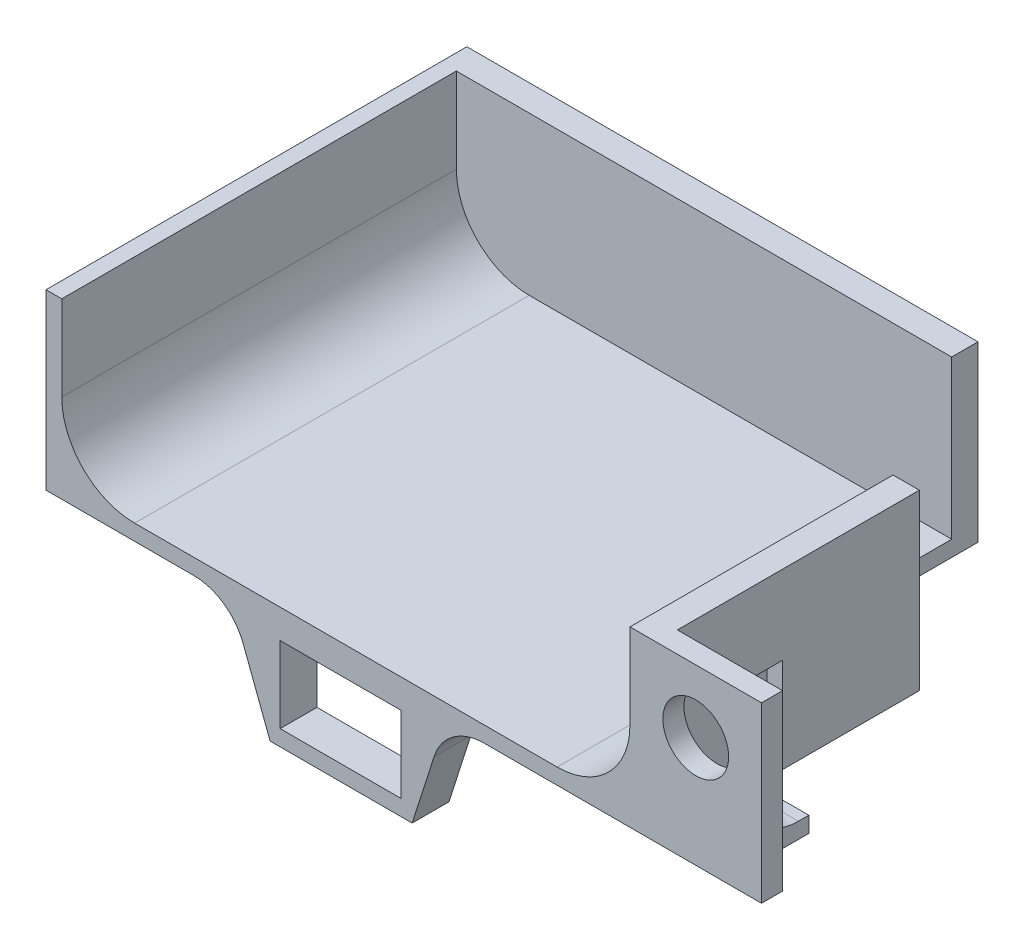
ISO-10303-21;
HEADER;
FILE_DESCRIPTION(('STEP AP214'),'2;1');
FILE_NAME('part.step','',(''),(''),'','','');
FILE_SCHEMA(('AUTOMOTIVE_DESIGN { 1 0 10303 214 1 1 1 1 }'));
ENDSEC;
DATA;
#1=APPLICATION_CONTEXT('core data for automotive mechanical design processes');
#2=APPLICATION_PROTOCOL_DEFINITION('international standard','automotive_design',2000,#1);
#3=PRODUCT_CONTEXT('',#1,'mechanical');
#4=PRODUCT('Part','Part','',(#3));
#5=PRODUCT_RELATED_PRODUCT_CATEGORY('part','',(#4));
#6=PRODUCT_DEFINITION_FORMATION('','',#4);
#7=PRODUCT_DEFINITION_CONTEXT('part definition',#1,'design');
#8=PRODUCT_DEFINITION('design','',#6,#7);
#9=PRODUCT_DEFINITION_SHAPE('','',#8);
#10=(LENGTH_UNIT() NAMED_UNIT(*) SI_UNIT(.MILLI.,.METRE.));
#11=(NAMED_UNIT(*) PLANE_ANGLE_UNIT() SI_UNIT($,.RADIAN.));
#12=(NAMED_UNIT(*) SI_UNIT($,.STERADIAN.) SOLID_ANGLE_UNIT());
#13=UNCERTAINTY_MEASURE_WITH_UNIT(LENGTH_MEASURE(1.E-05),#10,'distance_accuracy_value','');
#14=(GEOMETRIC_REPRESENTATION_CONTEXT(3) GLOBAL_UNCERTAINTY_ASSIGNED_CONTEXT((#13)) GLOBAL_UNIT_ASSIGNED_CONTEXT((#10,
#11,#12)) REPRESENTATION_CONTEXT('',''));
#15=CARTESIAN_POINT('',(0.,0.,0.));
#16=DIRECTION('',(0.,0.,1.));
#17=DIRECTION('',(1.,0.,0.));
#18=AXIS2_PLACEMENT_3D('',#15,#16,#17);
#19=CARTESIAN_POINT('',(0.,33.,0.));
#20=DIRECTION('',(0.,1.,0.));
#21=DIRECTION('',(0.,0.,1.));
#22=AXIS2_PLACEMENT_3D('',#19,#20,#21);
#23=PLANE('',#22);
#24=DIRECTION('',(1.,0.,0.));
#25=VECTOR('',#24,1.);
#26=CARTESIAN_POINT('',(138.,33.,-80.));
#27=LINE('',#26,#25);
#28=CARTESIAN_POINT('',(2.,33.,-80.));
#29=VERTEX_POINT('',#28);
#30=CARTESIAN_POINT('',(99.15,33.,-80.));
#31=VERTEX_POINT('',#30);
#32=EDGE_CURVE('E473',#29,#31,#27,.T.);
#33=ORIENTED_EDGE('',*,*,#32,.F.);
#34=DIRECTION('',(0.,0.,-1.));
#35=VECTOR('',#34,1.);
#36=CARTESIAN_POINT('',(2.,33.,-80.));
#37=LINE('',#36,#35);
#38=CARTESIAN_POINT('',(2.,33.,0.));
#39=VERTEX_POINT('',#38);
#40=EDGE_CURVE('E337',#39,#29,#37,.T.);
#41=ORIENTED_EDGE('',*,*,#40,.F.);
#42=DIRECTION('',(1.,0.,0.));
#43=VECTOR('',#42,1.);
#44=CARTESIAN_POINT('',(0.,33.,0.));
#45=LINE('',#44,#43);
#46=CARTESIAN_POINT('',(5.00000000000001,33.,0.));
#47=VERTEX_POINT('',#46);
#48=EDGE_CURVE('E494',#39,#47,#45,.T.);
#49=ORIENTED_EDGE('',*,*,#48,.T.);
#50=DIRECTION('',(0.,0.,-1.));
#51=VECTOR('',#50,1.);
#52=CARTESIAN_POINT('',(5.,33.,-75.));
#53=LINE('',#52,#51);
#54=CARTESIAN_POINT('',(5.,33.,-75.));
#55=VERTEX_POINT('',#54);
#56=EDGE_CURVE('E497',#47,#55,#53,.T.);
#57=ORIENTED_EDGE('',*,*,#56,.T.);
#58=DIRECTION('',(1.,0.,0.));
#59=VECTOR('',#58,1.);
#60=CARTESIAN_POINT('',(138.,33.,-75.));
#61=LINE('',#60,#59);
#62=CARTESIAN_POINT('',(99.15,33.,-75.));
#63=VERTEX_POINT('',#62);
#64=EDGE_CURVE('E466',#55,#63,#61,.T.);
#65=ORIENTED_EDGE('',*,*,#64,.T.);
#66=DIRECTION('',(0.,0.,1.));
#67=VECTOR('',#66,1.);
#68=CARTESIAN_POINT('',(99.15,33.,-80.));
#69=LINE('',#68,#67);
#70=EDGE_CURVE('E389',#31,#63,#69,.T.);
#71=ORIENTED_EDGE('',*,*,#70,.F.);
#72=EDGE_LOOP('',(#33,#41,#49,#57,#65,#71));
#73=FACE_BOUND('',#72,.T.);
#74=ADVANCED_FACE('F41',(#73),#23,.T.);
#75=CARTESIAN_POINT('',(0.,3.,0.));
#76=DIRECTION('',(0.,0.,-1.));
#77=DIRECTION('',(-1.,0.,0.));
#78=AXIS2_PLACEMENT_3D('',#75,#76,#77);
#79=PLANE('',#78);
#80=DIRECTION('',(0.,1.,0.));
#81=VECTOR('',#80,1.);
#82=CARTESIAN_POINT('',(69.5,-2.5,0.));
#83=LINE('',#82,#81);
#84=CARTESIAN_POINT('',(69.5,-17.,0.));
#85=VERTEX_POINT('',#84);
#86=CARTESIAN_POINT('',(69.5,-2.5,0.));
#87=VERTEX_POINT('',#86);
#88=EDGE_CURVE('E276',#85,#87,#83,.T.);
#89=ORIENTED_EDGE('',*,*,#88,.F.);
#90=DIRECTION('',(1.,0.,0.));
#91=VECTOR('',#90,1.);
#92=CARTESIAN_POINT('',(46.5,-17.,0.));
#93=LINE('',#92,#91);
#94=CARTESIAN_POINT('',(46.5,-17.,0.));
#95=VERTEX_POINT('',#94);
#96=EDGE_CURVE('E265',#95,#85,#93,.T.);
#97=ORIENTED_EDGE('',*,*,#96,.F.);
#98=DIRECTION('',(0.,-1.,0.));
#99=VECTOR('',#98,1.);
#100=CARTESIAN_POINT('',(46.5,-2.5,0.));
#101=LINE('',#100,#99);
#102=CARTESIAN_POINT('',(46.5,-2.5,0.));
#103=VERTEX_POINT('',#102);
#104=EDGE_CURVE('E280',#103,#95,#101,.T.);
#105=ORIENTED_EDGE('',*,*,#104,.F.);
#106=DIRECTION('',(-1.,0.,0.));
#107=VECTOR('',#106,1.);
#108=CARTESIAN_POINT('',(46.5,-2.5,0.));
#109=LINE('',#108,#107);
#110=EDGE_CURVE('E273',#87,#103,#109,.T.);
#111=ORIENTED_EDGE('',*,*,#110,.F.);
#112=EDGE_LOOP('',(#89,#97,#105,#111));
#113=FACE_BOUND('',#112,.T.);
#114=CARTESIAN_POINT('',(125.5,21.,0.));
#115=DIRECTION('',(0.,0.,1.));
#116=DIRECTION('',(1.,0.,0.));
#117=AXIS2_PLACEMENT_3D('',#114,#115,#116);
#118=CIRCLE('',#117,6.25);
#119=CARTESIAN_POINT('',(131.75,21.,0.));
#120=VERTEX_POINT('',#119);
#121=EDGE_CURVE('E442',#120,#120,#118,.T.);
#122=ORIENTED_EDGE('',*,*,#121,.F.);
#123=EDGE_LOOP('',(#122));
#124=FACE_BOUND('',#123,.T.);
#125=DIRECTION('',(0.,1.,0.));
#126=VECTOR('',#125,1.);
#127=CARTESIAN_POINT('',(2.,33.,0.));
#128=LINE('',#127,#126);
#129=CARTESIAN_POINT('',(2.,0.,0.));
#130=VERTEX_POINT('',#129);
#131=EDGE_CURVE('E334',#130,#39,#128,.T.);
#132=ORIENTED_EDGE('',*,*,#131,.F.);
#133=DIRECTION('',(1.,0.,0.));
#134=VECTOR('',#133,1.);
#135=CARTESIAN_POINT('',(0.,0.,0.));
#136=LINE('',#135,#134);
#137=CARTESIAN_POINT('',(30.1013293776752,0.,0.));
#138=VERTEX_POINT('',#137);
#139=EDGE_CURVE('E519',#130,#138,#136,.T.);
#140=ORIENTED_EDGE('',*,*,#139,.T.);
#141=CARTESIAN_POINT('',(30.1013293776752,-10.,0.));
#142=DIRECTION('',(0.,0.,-1.));
#143=DIRECTION('',(-1.,0.,0.));
#144=AXIS2_PLACEMENT_3D('',#141,#142,#143);
#145=CIRCLE('',#144,10.);
#146=CARTESIAN_POINT('',(39.4496499978006,-6.44909848301315,0.));
#147=VERTEX_POINT('',#146);
#148=EDGE_CURVE('E50',#138,#147,#145,.T.);
#149=ORIENTED_EDGE('',*,*,#148,.T.);
#150=DIRECTION('',(0.355090151698685,-0.934832062012533,0.));
#151=VECTOR('',#150,1.);
#152=CARTESIAN_POINT('',(37.,0.,0.));
#153=LINE('',#152,#151);
#154=CARTESIAN_POINT('',(44.5968757625672,-20.,0.));
#155=VERTEX_POINT('',#154);
#156=EDGE_CURVE('E296',#147,#155,#153,.T.);
#157=ORIENTED_EDGE('',*,*,#156,.T.);
#158=DIRECTION('',(1.,0.,0.));
#159=VECTOR('',#158,1.);
#160=CARTESIAN_POINT('',(44.5968757625672,-20.,0.));
#161=LINE('',#160,#159);
#162=CARTESIAN_POINT('',(71.5968757625672,-20.,0.));
#163=VERTEX_POINT('',#162);
#164=EDGE_CURVE('E315',#155,#163,#161,.T.);
#165=ORIENTED_EDGE('',*,*,#164,.T.);
#166=DIRECTION('',(0.304910677972993,0.952380952380952,0.));
#167=VECTOR('',#166,1.);
#168=CARTESIAN_POINT('',(71.5968757625672,-20.,0.));
#169=LINE('',#168,#167);
#170=CARTESIAN_POINT('',(75.7746283574741,-6.95089322027008,0.));
#171=VERTEX_POINT('',#170);
#172=EDGE_CURVE('E301',#163,#171,#169,.T.);
#173=ORIENTED_EDGE('',*,*,#172,.T.);
#174=CARTESIAN_POINT('',(85.2984378812836,-10.,0.));
#175=DIRECTION('',(0.,0.,-1.));
#176=DIRECTION('',(-1.,0.,0.));
#177=AXIS2_PLACEMENT_3D('',#174,#175,#176);
#178=CIRCLE('',#177,10.);
#179=CARTESIAN_POINT('',(85.2984378812836,0.,0.));
#180=VERTEX_POINT('',#179);
#181=EDGE_CURVE('E582',#171,#180,#178,.T.);
#182=ORIENTED_EDGE('',*,*,#181,.T.);
#183=CARTESIAN_POINT('',(138.,0.,0.));
#184=VERTEX_POINT('',#183);
#185=EDGE_CURVE('E508',#180,#184,#136,.T.);
#186=ORIENTED_EDGE('',*,*,#185,.T.);
#187=DIRECTION('',(0.,-1.,0.));
#188=VECTOR('',#187,1.);
#189=CARTESIAN_POINT('',(138.,3.,0.));
#190=LINE('',#189,#188);
#191=CARTESIAN_POINT('',(138.,33.,0.));
#192=VERTEX_POINT('',#191);
#193=EDGE_CURVE('E518',#192,#184,#190,.T.);
#194=ORIENTED_EDGE('',*,*,#193,.F.);
#195=DIRECTION('',(1.,0.,0.));
#196=VECTOR('',#195,1.);
#197=CARTESIAN_POINT('',(138.,33.,0.));
#198=LINE('',#197,#196);
#199=CARTESIAN_POINT('',(113.,33.,0.));
#200=VERTEX_POINT('',#199);
#201=EDGE_CURVE('E486',#200,#192,#198,.T.);
#202=ORIENTED_EDGE('',*,*,#201,.F.);
#203=DIRECTION('',(0.,-1.,0.));
#204=VECTOR('',#203,1.);
#205=CARTESIAN_POINT('',(113.,33.,0.));
#206=LINE('',#205,#204);
#207=CARTESIAN_POINT('',(113.,16.85,0.));
#208=VERTEX_POINT('',#207);
#209=EDGE_CURVE('E490',#200,#208,#206,.T.);
#210=ORIENTED_EDGE('',*,*,#209,.T.);
#211=CARTESIAN_POINT('',(99.15,16.85,0.));
#212=DIRECTION('',(0.,0.,-1.));
#213=DIRECTION('',(-1.,0.,0.));
#214=AXIS2_PLACEMENT_3D('',#211,#212,#213);
#215=CIRCLE('',#214,13.85);
#216=CARTESIAN_POINT('',(99.15,3.,0.));
#217=VERTEX_POINT('',#216);
#218=EDGE_CURVE('E542',#208,#217,#215,.T.);
#219=ORIENTED_EDGE('',*,*,#218,.T.);
#220=DIRECTION('',(1.,0.,0.));
#221=VECTOR('',#220,1.);
#222=CARTESIAN_POINT('',(0.,3.,0.));
#223=LINE('',#222,#221);
#224=CARTESIAN_POINT('',(18.85,3.,0.));
#225=VERTEX_POINT('',#224);
#226=EDGE_CURVE('E509',#225,#217,#223,.T.);
#227=ORIENTED_EDGE('',*,*,#226,.F.);
#228=CARTESIAN_POINT('',(18.85,16.85,0.));
#229=DIRECTION('',(0.,0.,-1.));
#230=DIRECTION('',(-1.,0.,0.));
#231=AXIS2_PLACEMENT_3D('',#228,#229,#230);
#232=CIRCLE('',#231,13.85);
#233=CARTESIAN_POINT('',(5.00000000000001,16.85,0.));
#234=VERTEX_POINT('',#233);
#235=EDGE_CURVE('E548',#225,#234,#232,.T.);
#236=ORIENTED_EDGE('',*,*,#235,.T.);
#237=DIRECTION('',(0.,-1.,0.));
#238=VECTOR('',#237,1.);
#239=CARTESIAN_POINT('',(5.00000000000001,33.,0.));
#240=LINE('',#239,#238);
#241=EDGE_CURVE('E504',#47,#234,#240,.T.);
#242=ORIENTED_EDGE('',*,*,#241,.F.);
#243=ORIENTED_EDGE('',*,*,#48,.F.);
#244=EDGE_LOOP('',(#132,#140,#149,#157,#165,#173,#182,#186,#194,#202,#210,#219,#227,#236,#242,#243));
#245=FACE_BOUND('',#244,.T.);
#246=ADVANCED_FACE('F591',(#113,#124,#245),#79,.F.);
#247=CARTESIAN_POINT('',(0.,0.,0.));
#248=DIRECTION('',(0.,-1.,0.));
#249=DIRECTION('',(0.,0.,-1.));
#250=AXIS2_PLACEMENT_3D('',#247,#248,#249);
#251=PLANE('',#250);
#252=ORIENTED_EDGE('',*,*,#185,.F.);
#253=DIRECTION('',(0.,0.,1.));
#254=VECTOR('',#253,1.);
#255=CARTESIAN_POINT('',(85.2984378812836,0.,-7.));
#256=LINE('',#255,#254);
#257=CARTESIAN_POINT('',(85.2984378812836,0.,-7.));
#258=VERTEX_POINT('',#257);
#259=EDGE_CURVE('E572',#180,#258,#256,.F.);
#260=ORIENTED_EDGE('',*,*,#259,.T.);
#261=DIRECTION('',(-1.,0.,0.));
#262=VECTOR('',#261,1.);
#263=CARTESIAN_POINT('',(78.,0.,-7.));
#264=LINE('',#263,#262);
#265=CARTESIAN_POINT('',(30.1013293776752,0.,-7.));
#266=VERTEX_POINT('',#265);
#267=EDGE_CURVE('E297',#258,#266,#264,.T.);
#268=ORIENTED_EDGE('',*,*,#267,.T.);
#269=DIRECTION('',(0.,0.,1.));
#270=VECTOR('',#269,1.);
#271=CARTESIAN_POINT('',(30.1013293776752,0.,0.));
#272=LINE('',#271,#270);
#273=EDGE_CURVE('E568',#266,#138,#272,.T.);
#274=ORIENTED_EDGE('',*,*,#273,.T.);
#275=ORIENTED_EDGE('',*,*,#139,.F.);
#276=DIRECTION('',(0.,0.,1.));
#277=VECTOR('',#276,1.);
#278=CARTESIAN_POINT('',(2.,0.,-80.));
#279=LINE('',#278,#277);
#280=CARTESIAN_POINT('',(2.,0.,-80.));
#281=VERTEX_POINT('',#280);
#282=EDGE_CURVE('E331',#281,#130,#279,.T.);
#283=ORIENTED_EDGE('',*,*,#282,.F.);
#284=DIRECTION('',(-1.,0.,0.));
#285=VECTOR('',#284,1.);
#286=CARTESIAN_POINT('',(138.,0.,-80.));
#287=LINE('',#286,#285);
#288=CARTESIAN_POINT('',(99.15,0.,-80.));
#289=VERTEX_POINT('',#288);
#290=EDGE_CURVE('E469',#289,#281,#287,.T.);
#291=ORIENTED_EDGE('',*,*,#290,.F.);
#292=DIRECTION('',(0.,0.,1.));
#293=VECTOR('',#292,1.);
#294=CARTESIAN_POINT('',(99.15,0.,-80.));
#295=LINE('',#294,#293);
#296=CARTESIAN_POINT('',(99.15,0.,-50.));
#297=VERTEX_POINT('',#296);
#298=EDGE_CURVE('E412',#289,#297,#295,.T.);
#299=ORIENTED_EDGE('',*,*,#298,.T.);
#300=DIRECTION('',(-1.,0.,0.));
#301=VECTOR('',#300,1.);
#302=CARTESIAN_POINT('',(138.,0.,-50.));
#303=LINE('',#302,#301);
#304=CARTESIAN_POINT('',(118.,0.,-50.));
#305=VERTEX_POINT('',#304);
#306=EDGE_CURVE('E439',#305,#297,#303,.T.);
#307=ORIENTED_EDGE('',*,*,#306,.F.);
#308=DIRECTION('',(0.,0.,1.));
#309=VECTOR('',#308,1.);
#310=CARTESIAN_POINT('',(118.,0.,-50.));
#311=LINE('',#310,#309);
#312=CARTESIAN_POINT('',(118.,0.,-24.));
#313=VERTEX_POINT('',#312);
#314=EDGE_CURVE('E361',#305,#313,#311,.T.);
#315=ORIENTED_EDGE('',*,*,#314,.T.);
#316=DIRECTION('',(-1.,0.,0.));
#317=VECTOR('',#316,1.);
#318=CARTESIAN_POINT('',(115.,0.,-24.));
#319=LINE('',#318,#317);
#320=CARTESIAN_POINT('',(115.,0.,-24.));
#321=VERTEX_POINT('',#320);
#322=EDGE_CURVE('E357',#313,#321,#319,.T.);
#323=ORIENTED_EDGE('',*,*,#322,.T.);
#324=DIRECTION('',(0.,0.,1.));
#325=VECTOR('',#324,1.);
#326=CARTESIAN_POINT('',(115.,0.,-24.));
#327=LINE('',#326,#325);
#328=CARTESIAN_POINT('',(115.,0.,-16.));
#329=VERTEX_POINT('',#328);
#330=EDGE_CURVE('E352',#321,#329,#327,.T.);
#331=ORIENTED_EDGE('',*,*,#330,.T.);
#332=DIRECTION('',(1.,0.,0.));
#333=VECTOR('',#332,1.);
#334=CARTESIAN_POINT('',(115.,0.,-16.));
#335=LINE('',#334,#333);
#336=CARTESIAN_POINT('',(131.,0.,-16.));
#337=VERTEX_POINT('',#336);
#338=EDGE_CURVE('E345',#329,#337,#335,.T.);
#339=ORIENTED_EDGE('',*,*,#338,.T.);
#340=DIRECTION('',(0.,0.,1.));
#341=VECTOR('',#340,1.);
#342=CARTESIAN_POINT('',(131.,0.,-16.));
#343=LINE('',#342,#341);
#344=CARTESIAN_POINT('',(131.,0.,-4.));
#345=VERTEX_POINT('',#344);
#346=EDGE_CURVE('E370',#337,#345,#343,.T.);
#347=ORIENTED_EDGE('',*,*,#346,.T.);
#348=DIRECTION('',(1.,0.,0.));
#349=VECTOR('',#348,1.);
#350=CARTESIAN_POINT('',(138.,0.,-4.));
#351=LINE('',#350,#349);
#352=CARTESIAN_POINT('',(138.,0.,-4.));
#353=VERTEX_POINT('',#352);
#354=EDGE_CURVE('E365',#345,#353,#351,.T.);
#355=ORIENTED_EDGE('',*,*,#354,.T.);
#356=DIRECTION('',(0.,0.,-1.));
#357=VECTOR('',#356,1.);
#358=CARTESIAN_POINT('',(138.,0.,0.));
#359=LINE('',#358,#357);
#360=EDGE_CURVE('E514',#184,#353,#359,.T.);
#361=ORIENTED_EDGE('',*,*,#360,.F.);
#362=EDGE_LOOP('',(#252,#260,#268,#274,#275,#283,#291,#299,#307,#315,#323,#331,#339,#347,#355,#361));
#363=FACE_BOUND('',#362,.T.);
#364=ADVANCED_FACE('F599',(#363),#251,.T.);
#365=CARTESIAN_POINT('',(0.,0.,-80.));
#366=DIRECTION('',(0.,0.,1.));
#367=DIRECTION('',(1.,0.,0.));
#368=AXIS2_PLACEMENT_3D('',#365,#366,#367);
#369=PLANE('',#368);
#370=DIRECTION('',(0.,-1.,0.));
#371=VECTOR('',#370,1.);
#372=CARTESIAN_POINT('',(2.,33.,-80.));
#373=LINE('',#372,#371);
#374=EDGE_CURVE('E325',#29,#281,#373,.T.);
#375=ORIENTED_EDGE('',*,*,#374,.F.);
#376=ORIENTED_EDGE('',*,*,#32,.T.);
#377=DIRECTION('',(0.,1.,0.));
#378=VECTOR('',#377,1.);
#379=CARTESIAN_POINT('',(99.15,-35.4305306197917,-80.));
#380=LINE('',#379,#378);
#381=EDGE_CURVE('E409',#289,#31,#380,.T.);
#382=ORIENTED_EDGE('',*,*,#381,.F.);
#383=ORIENTED_EDGE('',*,*,#290,.T.);
#384=EDGE_LOOP('',(#375,#376,#382,#383));
#385=FACE_BOUND('',#384,.T.);
#386=ADVANCED_FACE('F657',(#385),#369,.F.);
#387=CARTESIAN_POINT('',(0.,3.,0.));
#388=DIRECTION('',(0.,-1.,0.));
#389=DIRECTION('',(0.,0.,-1.));
#390=AXIS2_PLACEMENT_3D('',#387,#388,#389);
#391=PLANE('',#390);
#392=ORIENTED_EDGE('',*,*,#226,.T.);
#393=DIRECTION('',(0.,0.,1.));
#394=VECTOR('',#393,1.);
#395=CARTESIAN_POINT('',(99.15,3.,-75.));
#396=LINE('',#395,#394);
#397=CARTESIAN_POINT('',(99.15,3.,-50.));
#398=VERTEX_POINT('',#397);
#399=EDGE_CURVE('E534',#217,#398,#396,.F.);
#400=ORIENTED_EDGE('',*,*,#399,.T.);
#401=DIRECTION('',(0.,0.,-1.));
#402=VECTOR('',#401,1.);
#403=CARTESIAN_POINT('',(99.15,3.,-75.));
#404=LINE('',#403,#402);
#405=CARTESIAN_POINT('',(99.15,3.,-75.));
#406=VERTEX_POINT('',#405);
#407=EDGE_CURVE('E435',#398,#406,#404,.T.);
#408=ORIENTED_EDGE('',*,*,#407,.T.);
#409=DIRECTION('',(-1.,0.,0.));
#410=VECTOR('',#409,1.);
#411=CARTESIAN_POINT('',(0.,3.,-75.));
#412=LINE('',#411,#410);
#413=CARTESIAN_POINT('',(18.85,3.,-75.));
#414=VERTEX_POINT('',#413);
#415=EDGE_CURVE('E513',#406,#414,#412,.T.);
#416=ORIENTED_EDGE('',*,*,#415,.T.);
#417=DIRECTION('',(0.,0.,-1.));
#418=VECTOR('',#417,1.);
#419=CARTESIAN_POINT('',(18.85,3.,0.));
#420=LINE('',#419,#418);
#421=EDGE_CURVE('E531',#414,#225,#420,.F.);
#422=ORIENTED_EDGE('',*,*,#421,.T.);
#423=EDGE_LOOP('',(#392,#400,#408,#416,#422));
#424=FACE_BOUND('',#423,.T.);
#425=ADVANCED_FACE('F633',(#424),#391,.F.);
#426=CARTESIAN_POINT('',(138.,3.,0.));
#427=DIRECTION('',(-1.,0.,0.));
#428=DIRECTION('',(0.,0.,1.));
#429=AXIS2_PLACEMENT_3D('',#426,#427,#428);
#430=PLANE('',#429);
#431=ORIENTED_EDGE('',*,*,#360,.T.);
#432=DIRECTION('',(0.,1.,0.));
#433=VECTOR('',#432,1.);
#434=CARTESIAN_POINT('',(138.,3.,-4.));
#435=LINE('',#434,#433);
#436=CARTESIAN_POINT('',(138.,33.,-4.));
#437=VERTEX_POINT('',#436);
#438=EDGE_CURVE('E462',#353,#437,#435,.T.);
#439=ORIENTED_EDGE('',*,*,#438,.T.);
#440=DIRECTION('',(0.,0.,-1.));
#441=VECTOR('',#440,1.);
#442=CARTESIAN_POINT('',(138.,33.,-75.));
#443=LINE('',#442,#441);
#444=EDGE_CURVE('E476',#192,#437,#443,.T.);
#445=ORIENTED_EDGE('',*,*,#444,.F.);
#446=ORIENTED_EDGE('',*,*,#193,.T.);
#447=EDGE_LOOP('',(#431,#439,#445,#446));
#448=FACE_BOUND('',#447,.T.);
#449=ADVANCED_FACE('F598',(#448),#430,.F.);
#450=CARTESIAN_POINT('',(5.,33.,-75.));
#451=DIRECTION('',(-1.,0.,0.));
#452=DIRECTION('',(0.,0.,1.));
#453=AXIS2_PLACEMENT_3D('',#450,#451,#452);
#454=PLANE('',#453);
#455=ORIENTED_EDGE('',*,*,#241,.T.);
#456=DIRECTION('',(0.,0.,-1.));
#457=VECTOR('',#456,1.);
#458=CARTESIAN_POINT('',(5.,16.85,-75.));
#459=LINE('',#458,#457);
#460=CARTESIAN_POINT('',(5.,16.85,-75.));
#461=VERTEX_POINT('',#460);
#462=EDGE_CURVE('E538',#234,#461,#459,.T.);
#463=ORIENTED_EDGE('',*,*,#462,.T.);
#464=DIRECTION('',(0.,-1.,0.));
#465=VECTOR('',#464,1.);
#466=CARTESIAN_POINT('',(5.,33.,-75.));
#467=LINE('',#466,#465);
#468=EDGE_CURVE('E501',#55,#461,#467,.T.);
#469=ORIENTED_EDGE('',*,*,#468,.F.);
#470=ORIENTED_EDGE('',*,*,#56,.F.);
#471=EDGE_LOOP('',(#455,#463,#469,#470));
#472=FACE_BOUND('',#471,.T.);
#473=ADVANCED_FACE('F644',(#472),#454,.F.);
#474=DIRECTION('',(1.,0.,0.));
#475=VECTOR('',#474,1.);
#476=CARTESIAN_POINT('',(118.,33.,-50.));
#477=LINE('',#476,#475);
#478=CARTESIAN_POINT('',(113.,33.,-50.));
#479=VERTEX_POINT('',#478);
#480=CARTESIAN_POINT('',(118.,33.,-50.));
#481=VERTEX_POINT('',#480);
#482=EDGE_CURVE('E406',#479,#481,#477,.T.);
#483=ORIENTED_EDGE('',*,*,#482,.F.);
#484=DIRECTION('',(0.,0.,1.));
#485=VECTOR('',#484,1.);
#486=CARTESIAN_POINT('',(113.,33.,-75.));
#487=LINE('',#486,#485);
#488=EDGE_CURVE('E483',#479,#200,#487,.T.);
#489=ORIENTED_EDGE('',*,*,#488,.T.);
#490=ORIENTED_EDGE('',*,*,#201,.T.);
#491=ORIENTED_EDGE('',*,*,#444,.T.);
#492=DIRECTION('',(1.,0.,0.));
#493=VECTOR('',#492,1.);
#494=CARTESIAN_POINT('',(138.,33.,-4.));
#495=LINE('',#494,#493);
#496=CARTESIAN_POINT('',(118.,33.,-4.));
#497=VERTEX_POINT('',#496);
#498=EDGE_CURVE('E456',#497,#437,#495,.T.);
#499=ORIENTED_EDGE('',*,*,#498,.F.);
#500=DIRECTION('',(0.,0.,1.));
#501=VECTOR('',#500,1.);
#502=CARTESIAN_POINT('',(118.,33.,-80.));
#503=LINE('',#502,#501);
#504=EDGE_CURVE('E450',#481,#497,#503,.T.);
#505=ORIENTED_EDGE('',*,*,#504,.F.);
#506=EDGE_LOOP('',(#483,#489,#490,#491,#499,#505));
#507=FACE_BOUND('',#506,.T.);
#508=ADVANCED_FACE('F621',(#507),#23,.T.);
#509=CARTESIAN_POINT('',(113.,33.,-75.));
#510=DIRECTION('',(1.,0.,0.));
#511=DIRECTION('',(0.,0.,-1.));
#512=AXIS2_PLACEMENT_3D('',#509,#510,#511);
#513=PLANE('',#512);
#514=ORIENTED_EDGE('',*,*,#488,.F.);
#515=DIRECTION('',(0.,-1.,0.));
#516=VECTOR('',#515,1.);
#517=CARTESIAN_POINT('',(113.,33.,-50.));
#518=LINE('',#517,#516);
#519=CARTESIAN_POINT('',(113.,16.85,-50.));
#520=VERTEX_POINT('',#519);
#521=EDGE_CURVE('E431',#479,#520,#518,.T.);
#522=ORIENTED_EDGE('',*,*,#521,.T.);
#523=DIRECTION('',(0.,0.,1.));
#524=VECTOR('',#523,1.);
#525=CARTESIAN_POINT('',(113.,16.85,0.));
#526=LINE('',#525,#524);
#527=EDGE_CURVE('E528',#520,#208,#526,.T.);
#528=ORIENTED_EDGE('',*,*,#527,.T.);
#529=ORIENTED_EDGE('',*,*,#209,.F.);
#530=EDGE_LOOP('',(#514,#522,#528,#529));
#531=FACE_BOUND('',#530,.T.);
#532=ADVANCED_FACE('F627',(#531),#513,.F.);
#533=CARTESIAN_POINT('',(99.15,16.85,-75.));
#534=DIRECTION('',(0.,0.,-1.));
#535=DIRECTION('',(-1.,0.,0.));
#536=AXIS2_PLACEMENT_3D('',#533,#534,#535);
#537=CYLINDRICAL_SURFACE('',#536,13.85);
#538=ORIENTED_EDGE('',*,*,#527,.F.);
#539=CARTESIAN_POINT('',(99.15,16.85,-50.));
#540=DIRECTION('',(0.,0.,1.));
#541=DIRECTION('',(1.,0.,0.));
#542=AXIS2_PLACEMENT_3D('',#539,#540,#541);
#543=CIRCLE('',#542,13.85);
#544=EDGE_CURVE('E421',#520,#398,#543,.F.);
#545=ORIENTED_EDGE('',*,*,#544,.T.);
#546=ORIENTED_EDGE('',*,*,#399,.F.);
#547=ORIENTED_EDGE('',*,*,#218,.F.);
#548=EDGE_LOOP('',(#538,#545,#546,#547));
#549=FACE_BOUND('',#548,.T.);
#550=ADVANCED_FACE('F631',(#549),#537,.F.);
#551=CARTESIAN_POINT('',(18.85,16.85,-75.));
#552=DIRECTION('',(0.,0.,1.));
#553=DIRECTION('',(1.,0.,0.));
#554=AXIS2_PLACEMENT_3D('',#551,#552,#553);
#555=CYLINDRICAL_SURFACE('',#554,13.85);
#556=ORIENTED_EDGE('',*,*,#235,.F.);
#557=ORIENTED_EDGE('',*,*,#421,.F.);
#558=CARTESIAN_POINT('',(18.85,16.85,-75.));
#559=DIRECTION('',(0.,0.,1.));
#560=DIRECTION('',(1.,0.,0.));
#561=AXIS2_PLACEMENT_3D('',#558,#559,#560);
#562=CIRCLE('',#561,13.85);
#563=EDGE_CURVE('E545',#461,#414,#562,.T.);
#564=ORIENTED_EDGE('',*,*,#563,.F.);
#565=ORIENTED_EDGE('',*,*,#462,.F.);
#566=EDGE_LOOP('',(#556,#557,#564,#565));
#567=FACE_BOUND('',#566,.T.);
#568=ADVANCED_FACE('F640',(#567),#555,.F.);
#569=CARTESIAN_POINT('',(0.,0.,-75.));
#570=DIRECTION('',(0.,0.,1.));
#571=DIRECTION('',(1.,0.,0.));
#572=AXIS2_PLACEMENT_3D('',#569,#570,#571);
#573=PLANE('',#572);
#574=DIRECTION('',(0.,-1.,0.));
#575=VECTOR('',#574,1.);
#576=CARTESIAN_POINT('',(99.15,0.,-75.));
#577=LINE('',#576,#575);
#578=EDGE_CURVE('E551',#63,#406,#577,.T.);
#579=ORIENTED_EDGE('',*,*,#578,.F.);
#580=ORIENTED_EDGE('',*,*,#64,.F.);
#581=ORIENTED_EDGE('',*,*,#468,.T.);
#582=ORIENTED_EDGE('',*,*,#563,.T.);
#583=ORIENTED_EDGE('',*,*,#415,.F.);
#584=EDGE_LOOP('',(#579,#580,#581,#582,#583));
#585=FACE_BOUND('',#584,.T.);
#586=ADVANCED_FACE('F713',(#585),#573,.T.);
#587=CARTESIAN_POINT('',(138.,3.,-4.));
#588=DIRECTION('',(0.,0.,1.));
#589=DIRECTION('',(1.,0.,0.));
#590=AXIS2_PLACEMENT_3D('',#587,#588,#589);
#591=PLANE('',#590);
#592=CARTESIAN_POINT('',(125.5,21.,-4.));
#593=DIRECTION('',(0.,0.,1.));
#594=DIRECTION('',(1.,0.,0.));
#595=AXIS2_PLACEMENT_3D('',#592,#593,#594);
#596=CIRCLE('',#595,6.25);
#597=CARTESIAN_POINT('',(131.75,21.,-4.));
#598=VERTEX_POINT('',#597);
#599=EDGE_CURVE('E446',#598,#598,#596,.F.);
#600=ORIENTED_EDGE('',*,*,#599,.F.);
#601=EDGE_LOOP('',(#600));
#602=FACE_BOUND('',#601,.T.);
#603=DIRECTION('',(0.,1.,0.));
#604=VECTOR('',#603,1.);
#605=CARTESIAN_POINT('',(131.,-51.4295634824952,-4.));
#606=LINE('',#605,#604);
#607=CARTESIAN_POINT('',(131.,13.,-4.));
#608=VERTEX_POINT('',#607);
#609=EDGE_CURVE('E369',#345,#608,#606,.T.);
#610=ORIENTED_EDGE('',*,*,#609,.T.);
#611=DIRECTION('',(1.,0.,0.));
#612=VECTOR('',#611,1.);
#613=CARTESIAN_POINT('',(118.,13.,-4.));
#614=LINE('',#613,#612);
#615=CARTESIAN_POINT('',(118.,13.,-4.));
#616=VERTEX_POINT('',#615);
#617=EDGE_CURVE('E558',#608,#616,#614,.F.);
#618=ORIENTED_EDGE('',*,*,#617,.T.);
#619=DIRECTION('',(0.,1.,0.));
#620=VECTOR('',#619,1.);
#621=CARTESIAN_POINT('',(118.,3.,-4.));
#622=LINE('',#621,#620);
#623=EDGE_CURVE('E455',#616,#497,#622,.T.);
#624=ORIENTED_EDGE('',*,*,#623,.T.);
#625=ORIENTED_EDGE('',*,*,#498,.T.);
#626=ORIENTED_EDGE('',*,*,#438,.F.);
#627=ORIENTED_EDGE('',*,*,#354,.F.);
#628=EDGE_LOOP('',(#610,#618,#624,#625,#626,#627));
#629=FACE_BOUND('',#628,.T.);
#630=ADVANCED_FACE('F602',(#602,#629),#591,.F.);
#631=CARTESIAN_POINT('',(118.,3.,-80.));
#632=DIRECTION('',(-1.,0.,0.));
#633=DIRECTION('',(0.,0.,1.));
#634=AXIS2_PLACEMENT_3D('',#631,#632,#633);
#635=PLANE('',#634);
#636=ORIENTED_EDGE('',*,*,#623,.F.);
#637=CARTESIAN_POINT('',(118.,13.,-14.));
#638=DIRECTION('',(-1.,0.,0.));
#639=DIRECTION('',(0.,0.,1.));
#640=AXIS2_PLACEMENT_3D('',#637,#638,#639);
#641=CIRCLE('',#640,10.);
#642=CARTESIAN_POINT('',(118.,3.,-14.));
#643=VERTEX_POINT('',#642);
#644=EDGE_CURVE('E561',#616,#643,#641,.F.);
#645=ORIENTED_EDGE('',*,*,#644,.T.);
#646=DIRECTION('',(0.,0.,1.));
#647=VECTOR('',#646,1.);
#648=CARTESIAN_POINT('',(118.,3.,-80.));
#649=LINE('',#648,#647);
#650=CARTESIAN_POINT('',(118.,3.,-16.));
#651=VERTEX_POINT('',#650);
#652=EDGE_CURVE('E451',#651,#643,#649,.T.);
#653=ORIENTED_EDGE('',*,*,#652,.F.);
#654=DIRECTION('',(0.,-1.,0.));
#655=VECTOR('',#654,1.);
#656=CARTESIAN_POINT('',(118.,3.,-16.));
#657=LINE('',#656,#655);
#658=CARTESIAN_POINT('',(118.,18.,-16.));
#659=VERTEX_POINT('',#658);
#660=EDGE_CURVE('E356',#659,#651,#657,.T.);
#661=ORIENTED_EDGE('',*,*,#660,.F.);
#662=DIRECTION('',(0.,0.,1.));
#663=VECTOR('',#662,1.);
#664=CARTESIAN_POINT('',(118.,18.,-16.));
#665=LINE('',#664,#663);
#666=CARTESIAN_POINT('',(118.,18.,-24.));
#667=VERTEX_POINT('',#666);
#668=EDGE_CURVE('E397',#667,#659,#665,.T.);
#669=ORIENTED_EDGE('',*,*,#668,.F.);
#670=DIRECTION('',(0.,1.,0.));
#671=VECTOR('',#670,1.);
#672=CARTESIAN_POINT('',(118.,3.,-24.));
#673=LINE('',#672,#671);
#674=EDGE_CURVE('E393',#313,#667,#673,.T.);
#675=ORIENTED_EDGE('',*,*,#674,.F.);
#676=ORIENTED_EDGE('',*,*,#314,.F.);
#677=DIRECTION('',(0.,1.,0.));
#678=VECTOR('',#677,1.);
#679=CARTESIAN_POINT('',(118.,-35.4305306197917,-50.));
#680=LINE('',#679,#678);
#681=EDGE_CURVE('E417',#305,#481,#680,.T.);
#682=ORIENTED_EDGE('',*,*,#681,.T.);
#683=ORIENTED_EDGE('',*,*,#504,.T.);
#684=EDGE_LOOP('',(#636,#645,#653,#661,#669,#675,#676,#682,#683));
#685=FACE_BOUND('',#684,.T.);
#686=ADVANCED_FACE('F614',(#685),#635,.F.);
#687=CARTESIAN_POINT('',(0.,3.,0.));
#688=DIRECTION('',(0.,-1.,0.));
#689=DIRECTION('',(0.,0.,-1.));
#690=AXIS2_PLACEMENT_3D('',#687,#688,#689);
#691=PLANE('',#690);
#692=ORIENTED_EDGE('',*,*,#652,.T.);
#693=DIRECTION('',(1.,0.,0.));
#694=VECTOR('',#693,1.);
#695=CARTESIAN_POINT('',(131.,3.,-14.));
#696=LINE('',#695,#694);
#697=CARTESIAN_POINT('',(131.,3.,-14.));
#698=VERTEX_POINT('',#697);
#699=EDGE_CURVE('E554',#643,#698,#696,.T.);
#700=ORIENTED_EDGE('',*,*,#699,.T.);
#701=DIRECTION('',(0.,0.,1.));
#702=VECTOR('',#701,1.);
#703=CARTESIAN_POINT('',(131.,3.,-16.));
#704=LINE('',#703,#702);
#705=CARTESIAN_POINT('',(131.,3.,-16.));
#706=VERTEX_POINT('',#705);
#707=EDGE_CURVE('E341',#706,#698,#704,.T.);
#708=ORIENTED_EDGE('',*,*,#707,.F.);
#709=DIRECTION('',(1.,0.,0.));
#710=VECTOR('',#709,1.);
#711=CARTESIAN_POINT('',(115.,3.,-16.));
#712=LINE('',#711,#710);
#713=EDGE_CURVE('E340',#651,#706,#712,.T.);
#714=ORIENTED_EDGE('',*,*,#713,.F.);
#715=EDGE_LOOP('',(#692,#700,#708,#714));
#716=FACE_BOUND('',#715,.T.);
#717=ADVANCED_FACE('F729',(#716),#691,.F.);
#718=CARTESIAN_POINT('',(125.5,21.,-21.6776695296637));
#719=DIRECTION('',(0.,0.,1.));
#720=DIRECTION('',(1.,0.,0.));
#721=AXIS2_PLACEMENT_3D('',#718,#719,#720);
#722=CYLINDRICAL_SURFACE('',#721,6.25);
#723=ORIENTED_EDGE('',*,*,#599,.T.);
#724=EDGE_LOOP('',(#723));
#725=FACE_BOUND('',#724,.T.);
#726=ORIENTED_EDGE('',*,*,#121,.T.);
#727=EDGE_LOOP('',(#726));
#728=FACE_BOUND('',#727,.T.);
#729=ADVANCED_FACE('F733',(#725,#728),#722,.F.);
#730=CARTESIAN_POINT('',(0.,0.,-50.));
#731=DIRECTION('',(0.,0.,1.));
#732=DIRECTION('',(1.,0.,0.));
#733=AXIS2_PLACEMENT_3D('',#730,#731,#732);
#734=PLANE('',#733);
#735=ORIENTED_EDGE('',*,*,#681,.F.);
#736=ORIENTED_EDGE('',*,*,#306,.T.);
#737=DIRECTION('',(0.,1.,0.));
#738=VECTOR('',#737,1.);
#739=CARTESIAN_POINT('',(99.15,-35.4305306197917,-50.));
#740=LINE('',#739,#738);
#741=EDGE_CURVE('E416',#297,#398,#740,.T.);
#742=ORIENTED_EDGE('',*,*,#741,.T.);
#743=ORIENTED_EDGE('',*,*,#544,.F.);
#744=ORIENTED_EDGE('',*,*,#521,.F.);
#745=ORIENTED_EDGE('',*,*,#482,.T.);
#746=EDGE_LOOP('',(#735,#736,#742,#743,#744,#745));
#747=FACE_BOUND('',#746,.T.);
#748=ADVANCED_FACE('F737',(#747),#734,.F.);
#749=CARTESIAN_POINT('',(99.15,-35.4305306197917,-80.));
#750=DIRECTION('',(-1.,0.,0.));
#751=DIRECTION('',(0.,0.,1.));
#752=AXIS2_PLACEMENT_3D('',#749,#750,#751);
#753=PLANE('',#752);
#754=ORIENTED_EDGE('',*,*,#741,.F.);
#755=ORIENTED_EDGE('',*,*,#298,.F.);
#756=ORIENTED_EDGE('',*,*,#381,.T.);
#757=ORIENTED_EDGE('',*,*,#70,.T.);
#758=ORIENTED_EDGE('',*,*,#578,.T.);
#759=ORIENTED_EDGE('',*,*,#407,.F.);
#760=EDGE_LOOP('',(#754,#755,#756,#757,#758,#759));
#761=FACE_BOUND('',#760,.T.);
#762=ADVANCED_FACE('F741',(#761),#753,.F.);
#763=CARTESIAN_POINT('',(96.,3.,-16.));
#764=DIRECTION('',(0.,0.,1.));
#765=DIRECTION('',(1.,0.,0.));
#766=AXIS2_PLACEMENT_3D('',#763,#764,#765);
#767=PLANE('',#766);
#768=DIRECTION('',(0.,1.,0.));
#769=VECTOR('',#768,1.);
#770=CARTESIAN_POINT('',(115.,3.,-16.));
#771=LINE('',#770,#769);
#772=CARTESIAN_POINT('',(115.,18.,-16.));
#773=VERTEX_POINT('',#772);
#774=EDGE_CURVE('E386',#329,#773,#771,.T.);
#775=ORIENTED_EDGE('',*,*,#774,.T.);
#776=DIRECTION('',(1.,0.,0.));
#777=VECTOR('',#776,1.);
#778=CARTESIAN_POINT('',(96.,18.,-16.));
#779=LINE('',#778,#777);
#780=EDGE_CURVE('E383',#773,#659,#779,.T.);
#781=ORIENTED_EDGE('',*,*,#780,.T.);
#782=ORIENTED_EDGE('',*,*,#660,.T.);
#783=ORIENTED_EDGE('',*,*,#713,.T.);
#784=DIRECTION('',(0.,1.,0.));
#785=VECTOR('',#784,1.);
#786=CARTESIAN_POINT('',(131.,-51.4295634824952,-16.));
#787=LINE('',#786,#785);
#788=EDGE_CURVE('E351',#337,#706,#787,.T.);
#789=ORIENTED_EDGE('',*,*,#788,.F.);
#790=ORIENTED_EDGE('',*,*,#338,.F.);
#791=EDGE_LOOP('',(#775,#781,#782,#783,#789,#790));
#792=FACE_BOUND('',#791,.T.);
#793=ADVANCED_FACE('F745',(#792),#767,.F.);
#794=CARTESIAN_POINT('',(96.,18.,-16.));
#795=DIRECTION('',(0.,1.,0.));
#796=DIRECTION('',(0.,0.,1.));
#797=AXIS2_PLACEMENT_3D('',#794,#795,#796);
#798=PLANE('',#797);
#799=DIRECTION('',(0.,0.,-1.));
#800=VECTOR('',#799,1.);
#801=CARTESIAN_POINT('',(115.,18.,-16.));
#802=LINE('',#801,#800);
#803=CARTESIAN_POINT('',(115.,18.,-24.));
#804=VERTEX_POINT('',#803);
#805=EDGE_CURVE('E382',#773,#804,#802,.T.);
#806=ORIENTED_EDGE('',*,*,#805,.T.);
#807=DIRECTION('',(1.,0.,0.));
#808=VECTOR('',#807,1.);
#809=CARTESIAN_POINT('',(96.,18.,-24.));
#810=LINE('',#809,#808);
#811=EDGE_CURVE('E401',#804,#667,#810,.T.);
#812=ORIENTED_EDGE('',*,*,#811,.T.);
#813=ORIENTED_EDGE('',*,*,#668,.T.);
#814=ORIENTED_EDGE('',*,*,#780,.F.);
#815=EDGE_LOOP('',(#806,#812,#813,#814));
#816=FACE_BOUND('',#815,.T.);
#817=ADVANCED_FACE('F749',(#816),#798,.F.);
#818=CARTESIAN_POINT('',(96.,3.,-24.));
#819=DIRECTION('',(0.,0.,-1.));
#820=DIRECTION('',(-1.,0.,0.));
#821=AXIS2_PLACEMENT_3D('',#818,#819,#820);
#822=PLANE('',#821);
#823=DIRECTION('',(0.,-1.,0.));
#824=VECTOR('',#823,1.);
#825=CARTESIAN_POINT('',(115.,3.,-24.));
#826=LINE('',#825,#824);
#827=EDGE_CURVE('E379',#804,#321,#826,.T.);
#828=ORIENTED_EDGE('',*,*,#827,.T.);
#829=ORIENTED_EDGE('',*,*,#322,.F.);
#830=ORIENTED_EDGE('',*,*,#674,.T.);
#831=ORIENTED_EDGE('',*,*,#811,.F.);
#832=EDGE_LOOP('',(#828,#829,#830,#831));
#833=FACE_BOUND('',#832,.T.);
#834=ADVANCED_FACE('F751',(#833),#822,.F.);
#835=CARTESIAN_POINT('',(115.,33.,-75.));
#836=DIRECTION('',(1.,0.,0.));
#837=DIRECTION('',(0.,0.,-1.));
#838=AXIS2_PLACEMENT_3D('',#835,#836,#837);
#839=PLANE('',#838);
#840=ORIENTED_EDGE('',*,*,#774,.F.);
#841=ORIENTED_EDGE('',*,*,#330,.F.);
#842=ORIENTED_EDGE('',*,*,#827,.F.);
#843=ORIENTED_EDGE('',*,*,#805,.F.);
#844=EDGE_LOOP('',(#840,#841,#842,#843));
#845=FACE_BOUND('',#844,.T.);
#846=ADVANCED_FACE('F754',(#845),#839,.T.);
#847=CARTESIAN_POINT('',(131.,-51.4295634824952,-16.));
#848=DIRECTION('',(-1.,0.,0.));
#849=DIRECTION('',(0.,0.,1.));
#850=AXIS2_PLACEMENT_3D('',#847,#848,#849);
#851=PLANE('',#850);
#852=ORIENTED_EDGE('',*,*,#788,.T.);
#853=ORIENTED_EDGE('',*,*,#707,.T.);
#854=CARTESIAN_POINT('',(131.,13.,-14.));
#855=DIRECTION('',(-1.,0.,0.));
#856=DIRECTION('',(0.,0.,1.));
#857=AXIS2_PLACEMENT_3D('',#854,#855,#856);
#858=CIRCLE('',#857,10.);
#859=EDGE_CURVE('E578',#698,#608,#858,.T.);
#860=ORIENTED_EDGE('',*,*,#859,.T.);
#861=ORIENTED_EDGE('',*,*,#609,.F.);
#862=ORIENTED_EDGE('',*,*,#346,.F.);
#863=EDGE_LOOP('',(#852,#853,#860,#861,#862));
#864=FACE_BOUND('',#863,.T.);
#865=ADVANCED_FACE('F604',(#864),#851,.F.);
#866=CARTESIAN_POINT('',(2.,0.,0.));
#867=DIRECTION('',(-1.,0.,0.));
#868=DIRECTION('',(0.,0.,1.));
#869=AXIS2_PLACEMENT_3D('',#866,#867,#868);
#870=PLANE('',#869);
#871=ORIENTED_EDGE('',*,*,#374,.T.);
#872=ORIENTED_EDGE('',*,*,#282,.T.);
#873=ORIENTED_EDGE('',*,*,#131,.T.);
#874=ORIENTED_EDGE('',*,*,#40,.T.);
#875=EDGE_LOOP('',(#871,#872,#873,#874));
#876=FACE_BOUND('',#875,.T.);
#877=ADVANCED_FACE('F654',(#876),#870,.T.);
#878=CARTESIAN_POINT('',(71.5968757625672,-20.,-7.));
#879=DIRECTION('',(0.952380952380952,-0.304910677972993,0.));
#880=DIRECTION('',(0.304910677972993,0.952380952380953,0.));
#881=AXIS2_PLACEMENT_3D('',#878,#879,#880);
#882=PLANE('',#881);
#883=DIRECTION('',(0.304910677972993,0.952380952380952,0.));
#884=VECTOR('',#883,1.);
#885=CARTESIAN_POINT('',(71.5968757625672,-20.,-7.));
#886=LINE('',#885,#884);
#887=CARTESIAN_POINT('',(71.5968757625672,-20.,-7.));
#888=VERTEX_POINT('',#887);
#889=CARTESIAN_POINT('',(75.7746283574741,-6.95089322027008,-7.));
#890=VERTEX_POINT('',#889);
#891=EDGE_CURVE('E308',#888,#890,#886,.T.);
#892=ORIENTED_EDGE('',*,*,#891,.T.);
#893=DIRECTION('',(0.,0.,1.));
#894=VECTOR('',#893,1.);
#895=CARTESIAN_POINT('',(75.7746283574741,-6.95089322027008,0.));
#896=LINE('',#895,#894);
#897=EDGE_CURVE('E564',#890,#171,#896,.T.);
#898=ORIENTED_EDGE('',*,*,#897,.T.);
#899=ORIENTED_EDGE('',*,*,#172,.F.);
#900=DIRECTION('',(0.,0.,1.));
#901=VECTOR('',#900,1.);
#902=CARTESIAN_POINT('',(71.5968757625672,-20.,-7.));
#903=LINE('',#902,#901);
#904=EDGE_CURVE('E322',#888,#163,#903,.T.);
#905=ORIENTED_EDGE('',*,*,#904,.F.);
#906=EDGE_LOOP('',(#892,#898,#899,#905));
#907=FACE_BOUND('',#906,.T.);
#908=ADVANCED_FACE('F673',(#907),#882,.T.);
#909=CARTESIAN_POINT('',(44.5968757625672,-20.,-7.));
#910=DIRECTION('',(0.,-1.,0.));
#911=DIRECTION('',(0.,0.,-1.));
#912=AXIS2_PLACEMENT_3D('',#909,#910,#911);
#913=PLANE('',#912);
#914=ORIENTED_EDGE('',*,*,#164,.F.);
#915=DIRECTION('',(0.,0.,1.));
#916=VECTOR('',#915,1.);
#917=CARTESIAN_POINT('',(44.5968757625672,-20.,-7.));
#918=LINE('',#917,#916);
#919=CARTESIAN_POINT('',(44.5968757625672,-20.,-7.));
#920=VERTEX_POINT('',#919);
#921=EDGE_CURVE('E312',#920,#155,#918,.T.);
#922=ORIENTED_EDGE('',*,*,#921,.F.);
#923=DIRECTION('',(1.,0.,0.));
#924=VECTOR('',#923,1.);
#925=CARTESIAN_POINT('',(44.5968757625672,-20.,-7.));
#926=LINE('',#925,#924);
#927=EDGE_CURVE('E304',#920,#888,#926,.T.);
#928=ORIENTED_EDGE('',*,*,#927,.T.);
#929=ORIENTED_EDGE('',*,*,#904,.T.);
#930=EDGE_LOOP('',(#914,#922,#928,#929));
#931=FACE_BOUND('',#930,.T.);
#932=ADVANCED_FACE('F670',(#931),#913,.T.);
#933=CARTESIAN_POINT('',(37.,0.,-7.));
#934=DIRECTION('',(-0.934832062012533,-0.355090151698685,0.));
#935=DIRECTION('',(0.355090151698685,-0.934832062012533,0.));
#936=AXIS2_PLACEMENT_3D('',#933,#934,#935);
#937=PLANE('',#936);
#938=ORIENTED_EDGE('',*,*,#156,.F.);
#939=DIRECTION('',(0.,0.,1.));
#940=VECTOR('',#939,1.);
#941=CARTESIAN_POINT('',(39.4496499978006,-6.44909848301315,-7.));
#942=LINE('',#941,#940);
#943=CARTESIAN_POINT('',(39.4496499978006,-6.44909848301315,-7.));
#944=VERTEX_POINT('',#943);
#945=EDGE_CURVE('E57',#147,#944,#942,.F.);
#946=ORIENTED_EDGE('',*,*,#945,.T.);
#947=DIRECTION('',(0.355090151698685,-0.934832062012533,0.));
#948=VECTOR('',#947,1.);
#949=CARTESIAN_POINT('',(37.,0.,-7.));
#950=LINE('',#949,#948);
#951=EDGE_CURVE('E300',#944,#920,#950,.T.);
#952=ORIENTED_EDGE('',*,*,#951,.T.);
#953=ORIENTED_EDGE('',*,*,#921,.T.);
#954=EDGE_LOOP('',(#938,#946,#952,#953));
#955=FACE_BOUND('',#954,.T.);
#956=ADVANCED_FACE('F667',(#955),#937,.T.);
#957=CARTESIAN_POINT('',(0.,0.,-7.));
#958=DIRECTION('',(0.,0.,-1.));
#959=DIRECTION('',(-1.,0.,0.));
#960=AXIS2_PLACEMENT_3D('',#957,#958,#959);
#961=PLANE('',#960);
#962=DIRECTION('',(1.,0.,0.));
#963=VECTOR('',#962,1.);
#964=CARTESIAN_POINT('',(46.5,-17.,-7.));
#965=LINE('',#964,#963);
#966=CARTESIAN_POINT('',(46.5,-17.,-7.));
#967=VERTEX_POINT('',#966);
#968=CARTESIAN_POINT('',(69.5,-17.,-7.));
#969=VERTEX_POINT('',#968);
#970=EDGE_CURVE('E262',#967,#969,#965,.T.);
#971=ORIENTED_EDGE('',*,*,#970,.T.);
#972=DIRECTION('',(0.,1.,0.));
#973=VECTOR('',#972,1.);
#974=CARTESIAN_POINT('',(69.5,-2.5,-7.));
#975=LINE('',#974,#973);
#976=CARTESIAN_POINT('',(69.5,-2.5,-7.));
#977=VERTEX_POINT('',#976);
#978=EDGE_CURVE('E247',#969,#977,#975,.T.);
#979=ORIENTED_EDGE('',*,*,#978,.T.);
#980=DIRECTION('',(-1.,0.,0.));
#981=VECTOR('',#980,1.);
#982=CARTESIAN_POINT('',(46.5,-2.5,-7.));
#983=LINE('',#982,#981);
#984=CARTESIAN_POINT('',(46.5,-2.5,-7.));
#985=VERTEX_POINT('',#984);
#986=EDGE_CURVE('E286',#977,#985,#983,.T.);
#987=ORIENTED_EDGE('',*,*,#986,.T.);
#988=DIRECTION('',(0.,-1.,0.));
#989=VECTOR('',#988,1.);
#990=CARTESIAN_POINT('',(46.5,-2.5,-7.));
#991=LINE('',#990,#989);
#992=EDGE_CURVE('E271',#985,#967,#991,.T.);
#993=ORIENTED_EDGE('',*,*,#992,.T.);
#994=EDGE_LOOP('',(#971,#979,#987,#993));
#995=FACE_BOUND('',#994,.T.);
#996=ORIENTED_EDGE('',*,*,#267,.F.);
#997=CARTESIAN_POINT('',(85.2984378812836,-10.,-7.));
#998=DIRECTION('',(0.,0.,-1.));
#999=DIRECTION('',(-1.,0.,0.));
#1000=AXIS2_PLACEMENT_3D('',#997,#998,#999);
#1001=CIRCLE('',#1000,10.);
#1002=EDGE_CURVE('E585',#258,#890,#1001,.F.);
#1003=ORIENTED_EDGE('',*,*,#1002,.T.);
#1004=ORIENTED_EDGE('',*,*,#891,.F.);
#1005=ORIENTED_EDGE('',*,*,#927,.F.);
#1006=ORIENTED_EDGE('',*,*,#951,.F.);
#1007=CARTESIAN_POINT('',(30.1013293776752,-10.,-7.));
#1008=DIRECTION('',(0.,0.,-1.));
#1009=DIRECTION('',(-1.,0.,0.));
#1010=AXIS2_PLACEMENT_3D('',#1007,#1008,#1009);
#1011=CIRCLE('',#1010,10.);
#1012=EDGE_CURVE('E12',#944,#266,#1011,.F.);
#1013=ORIENTED_EDGE('',*,*,#1012,.T.);
#1014=EDGE_LOOP('',(#996,#1003,#1004,#1005,#1006,#1013));
#1015=FACE_BOUND('',#1014,.T.);
#1016=ADVANCED_FACE('F269',(#995,#1015),#961,.T.);
#1017=CARTESIAN_POINT('',(46.5,-17.,-34.1891522486451));
#1018=DIRECTION('',(0.,-1.,0.));
#1019=DIRECTION('',(1.,0.,0.));
#1020=AXIS2_PLACEMENT_3D('',#1017,#1018,#1019);
#1021=PLANE('',#1020);
#1022=DIRECTION('',(0.,0.,1.));
#1023=VECTOR('',#1022,1.);
#1024=CARTESIAN_POINT('',(46.5,-17.,-34.1891522486451));
#1025=LINE('',#1024,#1023);
#1026=EDGE_CURVE('E284',#967,#95,#1025,.T.);
#1027=ORIENTED_EDGE('',*,*,#1026,.T.);
#1028=ORIENTED_EDGE('',*,*,#96,.T.);
#1029=DIRECTION('',(0.,0.,1.));
#1030=VECTOR('',#1029,1.);
#1031=CARTESIAN_POINT('',(69.5,-17.,-34.1891522486451));
#1032=LINE('',#1031,#1030);
#1033=EDGE_CURVE('E251',#969,#85,#1032,.T.);
#1034=ORIENTED_EDGE('',*,*,#1033,.F.);
#1035=ORIENTED_EDGE('',*,*,#970,.F.);
#1036=EDGE_LOOP('',(#1027,#1028,#1034,#1035));
#1037=FACE_BOUND('',#1036,.T.);
#1038=ADVANCED_FACE('F261',(#1037),#1021,.F.);
#1039=CARTESIAN_POINT('',(69.5,-2.5,-34.1891522486451));
#1040=DIRECTION('',(1.,0.,0.));
#1041=DIRECTION('',(0.,0.,-1.));
#1042=AXIS2_PLACEMENT_3D('',#1039,#1040,#1041);
#1043=PLANE('',#1042);
#1044=ORIENTED_EDGE('',*,*,#1033,.T.);
#1045=ORIENTED_EDGE('',*,*,#88,.T.);
#1046=DIRECTION('',(0.,0.,1.));
#1047=VECTOR('',#1046,1.);
#1048=CARTESIAN_POINT('',(69.5,-2.5,-34.1891522486451));
#1049=LINE('',#1048,#1047);
#1050=EDGE_CURVE('E253',#977,#87,#1049,.T.);
#1051=ORIENTED_EDGE('',*,*,#1050,.F.);
#1052=ORIENTED_EDGE('',*,*,#978,.F.);
#1053=EDGE_LOOP('',(#1044,#1045,#1051,#1052));
#1054=FACE_BOUND('',#1053,.T.);
#1055=ADVANCED_FACE('F249',(#1054),#1043,.F.);
#1056=CARTESIAN_POINT('',(46.5,-2.5,-34.1891522486451));
#1057=DIRECTION('',(0.,1.,0.));
#1058=DIRECTION('',(0.,0.,1.));
#1059=AXIS2_PLACEMENT_3D('',#1056,#1057,#1058);
#1060=PLANE('',#1059);
#1061=ORIENTED_EDGE('',*,*,#1050,.T.);
#1062=ORIENTED_EDGE('',*,*,#110,.T.);
#1063=DIRECTION('',(0.,0.,1.));
#1064=VECTOR('',#1063,1.);
#1065=CARTESIAN_POINT('',(46.5,-2.5,-34.1891522486451));
#1066=LINE('',#1065,#1064);
#1067=EDGE_CURVE('E285',#985,#103,#1066,.T.);
#1068=ORIENTED_EDGE('',*,*,#1067,.F.);
#1069=ORIENTED_EDGE('',*,*,#986,.F.);
#1070=EDGE_LOOP('',(#1061,#1062,#1068,#1069));
#1071=FACE_BOUND('',#1070,.T.);
#1072=ADVANCED_FACE('F778',(#1071),#1060,.F.);
#1073=CARTESIAN_POINT('',(46.5,-2.5,-34.1891522486451));
#1074=DIRECTION('',(-1.,0.,0.));
#1075=DIRECTION('',(0.,0.,1.));
#1076=AXIS2_PLACEMENT_3D('',#1073,#1074,#1075);
#1077=PLANE('',#1076);
#1078=ORIENTED_EDGE('',*,*,#1067,.T.);
#1079=ORIENTED_EDGE('',*,*,#104,.T.);
#1080=ORIENTED_EDGE('',*,*,#1026,.F.);
#1081=ORIENTED_EDGE('',*,*,#992,.F.);
#1082=EDGE_LOOP('',(#1078,#1079,#1080,#1081));
#1083=FACE_BOUND('',#1082,.T.);
#1084=ADVANCED_FACE('F683',(#1083),#1077,.F.);
#1085=CARTESIAN_POINT('',(0.,13.,-14.));
#1086=DIRECTION('',(-1.,0.,0.));
#1087=DIRECTION('',(0.,0.,1.));
#1088=AXIS2_PLACEMENT_3D('',#1085,#1086,#1087);
#1089=CYLINDRICAL_SURFACE('',#1088,10.);
#1090=ORIENTED_EDGE('',*,*,#644,.F.);
#1091=ORIENTED_EDGE('',*,*,#617,.F.);
#1092=ORIENTED_EDGE('',*,*,#859,.F.);
#1093=ORIENTED_EDGE('',*,*,#699,.F.);
#1094=EDGE_LOOP('',(#1090,#1091,#1092,#1093));
#1095=FACE_BOUND('',#1094,.T.);
#1096=ADVANCED_FACE('F611',(#1095),#1089,.F.);
#1097=CARTESIAN_POINT('',(85.2984378812836,-10.,-7.));
#1098=DIRECTION('',(0.,0.,-1.));
#1099=DIRECTION('',(-1.,0.,0.));
#1100=AXIS2_PLACEMENT_3D('',#1097,#1098,#1099);
#1101=CYLINDRICAL_SURFACE('',#1100,10.);
#1102=ORIENTED_EDGE('',*,*,#1002,.F.);
#1103=ORIENTED_EDGE('',*,*,#259,.F.);
#1104=ORIENTED_EDGE('',*,*,#181,.F.);
#1105=ORIENTED_EDGE('',*,*,#897,.F.);
#1106=EDGE_LOOP('',(#1102,#1103,#1104,#1105));
#1107=FACE_BOUND('',#1106,.T.);
#1108=ADVANCED_FACE('F677',(#1107),#1101,.F.);
#1109=CARTESIAN_POINT('',(30.1013293776752,-10.,0.));
#1110=DIRECTION('',(0.,0.,-1.));
#1111=DIRECTION('',(-1.,0.,0.));
#1112=AXIS2_PLACEMENT_3D('',#1109,#1110,#1111);
#1113=CYLINDRICAL_SURFACE('',#1112,10.);
#1114=ORIENTED_EDGE('',*,*,#1012,.F.);
#1115=ORIENTED_EDGE('',*,*,#945,.F.);
#1116=ORIENTED_EDGE('',*,*,#148,.F.);
#1117=ORIENTED_EDGE('',*,*,#273,.F.);
#1118=EDGE_LOOP('',(#1114,#1115,#1116,#1117));
#1119=FACE_BOUND('',#1118,.T.);
#1120=ADVANCED_FACE('F43',(#1119),#1113,.F.);
#1121=CLOSED_SHELL('',(#74,#246,#364,#386,#425,#449,#473,#508,#532,#550,#568,#586,#630,#686,
#717,#729,#748,#762,#793,#817,#834,#846,#865,#877,#908,#932,#956,#1016,#1038,#1055,#1072,#1084,
#1096,#1108,#1120));
#1122=MANIFOLD_SOLID_BREP('B2',#1121);
#1123=ADVANCED_BREP_SHAPE_REPRESENTATION('',(#18,#1122),#14);
#1124=SHAPE_DEFINITION_REPRESENTATION(#9,#1123);
ENDSEC;
END-ISO-10303-21;
